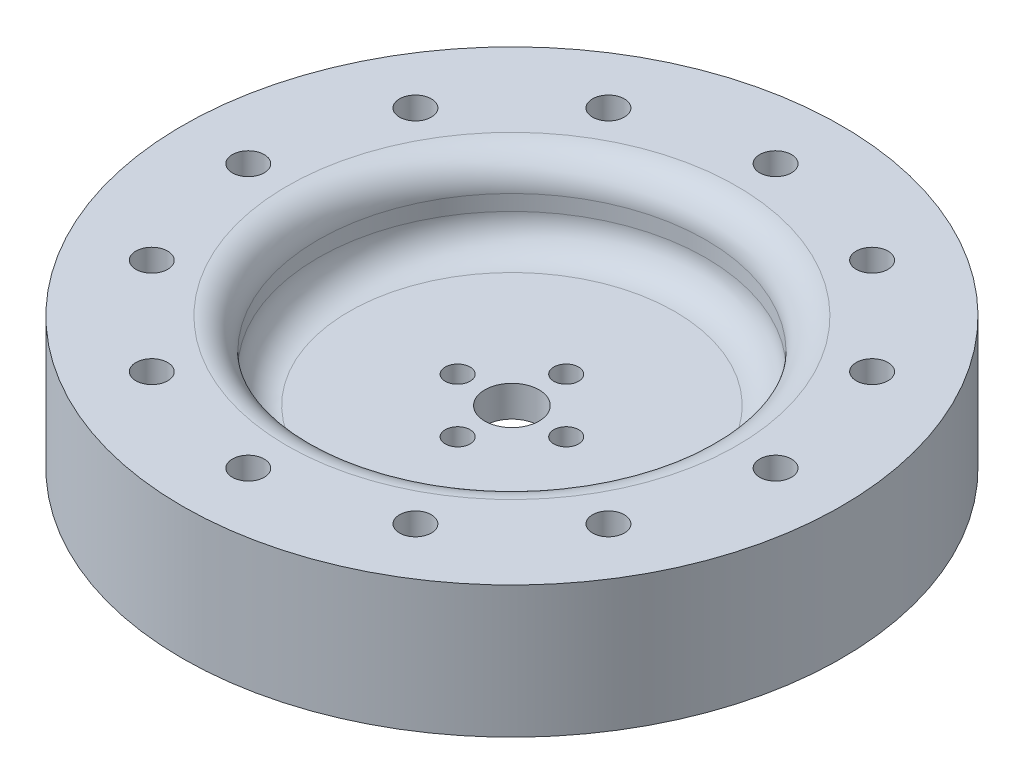
ISO-10303-21;
HEADER;
FILE_DESCRIPTION(('STEP AP214'),'2;1');
FILE_NAME('part.step','',(''),(''),'','','');
FILE_SCHEMA(('AUTOMOTIVE_DESIGN { 1 0 10303 214 1 1 1 1 }'));
ENDSEC;
DATA;
#1=APPLICATION_CONTEXT('core data for automotive mechanical design processes');
#2=APPLICATION_PROTOCOL_DEFINITION('international standard','automotive_design',2000,#1);
#3=PRODUCT_CONTEXT('',#1,'mechanical');
#4=PRODUCT('Part','Part','',(#3));
#5=PRODUCT_RELATED_PRODUCT_CATEGORY('part','',(#4));
#6=PRODUCT_DEFINITION_FORMATION('','',#4);
#7=PRODUCT_DEFINITION_CONTEXT('part definition',#1,'design');
#8=PRODUCT_DEFINITION('design','',#6,#7);
#9=PRODUCT_DEFINITION_SHAPE('','',#8);
#10=(LENGTH_UNIT() NAMED_UNIT(*) SI_UNIT(.MILLI.,.METRE.));
#11=(NAMED_UNIT(*) PLANE_ANGLE_UNIT() SI_UNIT($,.RADIAN.));
#12=(NAMED_UNIT(*) SI_UNIT($,.STERADIAN.) SOLID_ANGLE_UNIT());
#13=UNCERTAINTY_MEASURE_WITH_UNIT(LENGTH_MEASURE(1.E-05),#10,'distance_accuracy_value','');
#14=(GEOMETRIC_REPRESENTATION_CONTEXT(3) GLOBAL_UNCERTAINTY_ASSIGNED_CONTEXT((#13)) GLOBAL_UNIT_ASSIGNED_CONTEXT((#10,
#11,#12)) REPRESENTATION_CONTEXT('',''));
#15=CARTESIAN_POINT('',(0.,0.,0.));
#16=DIRECTION('',(0.,0.,1.));
#17=DIRECTION('',(1.,0.,0.));
#18=AXIS2_PLACEMENT_3D('',#15,#16,#17);
#19=CARTESIAN_POINT('',(7.,17.,0.));
#20=DIRECTION('',(0.,-1.,0.));
#21=DIRECTION('',(0.,0.,-1.));
#22=AXIS2_PLACEMENT_3D('',#19,#20,#21);
#23=CYLINDRICAL_SURFACE('',#22,1.6);
#24=CARTESIAN_POINT('',(7.,7.,0.));
#25=DIRECTION('',(0.,1.,0.));
#26=DIRECTION('',(0.,0.,1.));
#27=AXIS2_PLACEMENT_3D('',#24,#25,#26);
#28=CIRCLE('',#27,1.6);
#29=CARTESIAN_POINT('',(7.,7.,1.6));
#30=VERTEX_POINT('',#29);
#31=EDGE_CURVE('E140',#30,#30,#28,.T.);
#32=ORIENTED_EDGE('',*,*,#31,.T.);
#33=EDGE_LOOP('',(#32));
#34=FACE_BOUND('',#33,.T.);
#35=CARTESIAN_POINT('',(7.,3.,0.));
#36=DIRECTION('',(0.,-1.,0.));
#37=DIRECTION('',(0.,0.,-1.));
#38=AXIS2_PLACEMENT_3D('',#35,#36,#37);
#39=CIRCLE('',#38,1.6);
#40=CARTESIAN_POINT('',(7.,3.,-1.6));
#41=VERTEX_POINT('',#40);
#42=EDGE_CURVE('E64',#41,#41,#39,.T.);
#43=ORIENTED_EDGE('',*,*,#42,.T.);
#44=EDGE_LOOP('',(#43));
#45=FACE_BOUND('',#44,.T.);
#46=ADVANCED_FACE('F39',(#34,#45),#23,.F.);
#47=CARTESIAN_POINT('',(0.,17.,0.));
#48=DIRECTION('',(0.,-1.,0.));
#49=DIRECTION('',(0.,0.,-1.));
#50=AXIS2_PLACEMENT_3D('',#47,#48,#49);
#51=CYLINDRICAL_SURFACE('',#50,3.5);
#52=CARTESIAN_POINT('',(0.,7.,0.));
#53=DIRECTION('',(0.,1.,0.));
#54=DIRECTION('',(0.,0.,1.));
#55=AXIS2_PLACEMENT_3D('',#52,#53,#54);
#56=CIRCLE('',#55,3.5);
#57=CARTESIAN_POINT('',(0.,7.,3.5));
#58=VERTEX_POINT('',#57);
#59=EDGE_CURVE('E145',#58,#58,#56,.T.);
#60=ORIENTED_EDGE('',*,*,#59,.T.);
#61=EDGE_LOOP('',(#60));
#62=FACE_BOUND('',#61,.T.);
#63=CARTESIAN_POINT('',(0.,3.,0.));
#64=DIRECTION('',(0.,-1.,0.));
#65=DIRECTION('',(0.,0.,-1.));
#66=AXIS2_PLACEMENT_3D('',#63,#64,#65);
#67=CIRCLE('',#66,3.5);
#68=CARTESIAN_POINT('',(0.,3.,-3.5));
#69=VERTEX_POINT('',#68);
#70=EDGE_CURVE('E155',#69,#69,#67,.T.);
#71=ORIENTED_EDGE('',*,*,#70,.T.);
#72=EDGE_LOOP('',(#71));
#73=FACE_BOUND('',#72,.T.);
#74=ADVANCED_FACE('F189',(#62,#73),#51,.F.);
#75=CARTESIAN_POINT('',(0.,17.,7.));
#76=DIRECTION('',(0.,-1.,0.));
#77=DIRECTION('',(0.,0.,-1.));
#78=AXIS2_PLACEMENT_3D('',#75,#76,#77);
#79=CYLINDRICAL_SURFACE('',#78,1.6);
#80=CARTESIAN_POINT('',(0.,7.,7.));
#81=DIRECTION('',(0.,1.,0.));
#82=DIRECTION('',(0.,0.,1.));
#83=AXIS2_PLACEMENT_3D('',#80,#81,#82);
#84=CIRCLE('',#83,1.6);
#85=CARTESIAN_POINT('',(0.,7.,8.6));
#86=VERTEX_POINT('',#85);
#87=EDGE_CURVE('E148',#86,#86,#84,.T.);
#88=ORIENTED_EDGE('',*,*,#87,.T.);
#89=EDGE_LOOP('',(#88));
#90=FACE_BOUND('',#89,.T.);
#91=CARTESIAN_POINT('',(0.,3.,7.));
#92=DIRECTION('',(0.,-1.,0.));
#93=DIRECTION('',(0.,0.,-1.));
#94=AXIS2_PLACEMENT_3D('',#91,#92,#93);
#95=CIRCLE('',#94,1.6);
#96=CARTESIAN_POINT('',(0.,3.,5.4));
#97=VERTEX_POINT('',#96);
#98=EDGE_CURVE('E158',#97,#97,#95,.T.);
#99=ORIENTED_EDGE('',*,*,#98,.T.);
#100=EDGE_LOOP('',(#99));
#101=FACE_BOUND('',#100,.T.);
#102=ADVANCED_FACE('F195',(#90,#101),#79,.F.);
#103=CARTESIAN_POINT('',(-7.,17.,0.));
#104=DIRECTION('',(0.,-1.,0.));
#105=DIRECTION('',(0.,0.,-1.));
#106=AXIS2_PLACEMENT_3D('',#103,#104,#105);
#107=CYLINDRICAL_SURFACE('',#106,1.6);
#108=CARTESIAN_POINT('',(-7.,7.,0.));
#109=DIRECTION('',(0.,1.,0.));
#110=DIRECTION('',(0.,0.,1.));
#111=AXIS2_PLACEMENT_3D('',#108,#109,#110);
#112=CIRCLE('',#111,1.6);
#113=CARTESIAN_POINT('',(-7.,7.,1.6));
#114=VERTEX_POINT('',#113);
#115=EDGE_CURVE('E63',#114,#114,#112,.T.);
#116=ORIENTED_EDGE('',*,*,#115,.T.);
#117=EDGE_LOOP('',(#116));
#118=FACE_BOUND('',#117,.T.);
#119=CARTESIAN_POINT('',(-7.,3.,0.));
#120=DIRECTION('',(0.,-1.,0.));
#121=DIRECTION('',(0.,0.,-1.));
#122=AXIS2_PLACEMENT_3D('',#119,#120,#121);
#123=CIRCLE('',#122,1.6);
#124=CARTESIAN_POINT('',(-7.,3.,-1.6));
#125=VERTEX_POINT('',#124);
#126=EDGE_CURVE('E161',#125,#125,#123,.T.);
#127=ORIENTED_EDGE('',*,*,#126,.T.);
#128=EDGE_LOOP('',(#127));
#129=FACE_BOUND('',#128,.T.);
#130=ADVANCED_FACE('F243',(#118,#129),#107,.F.);
#131=CARTESIAN_POINT('',(0.,17.,-7.));
#132=DIRECTION('',(0.,-1.,0.));
#133=DIRECTION('',(0.,0.,-1.));
#134=AXIS2_PLACEMENT_3D('',#131,#132,#133);
#135=CYLINDRICAL_SURFACE('',#134,1.6);
#136=CARTESIAN_POINT('',(0.,7.,-7.));
#137=DIRECTION('',(0.,1.,0.));
#138=DIRECTION('',(0.,0.,1.));
#139=AXIS2_PLACEMENT_3D('',#136,#137,#138);
#140=CIRCLE('',#139,1.6);
#141=CARTESIAN_POINT('',(0.,7.,-5.4));
#142=VERTEX_POINT('',#141);
#143=EDGE_CURVE('E60',#142,#142,#140,.T.);
#144=ORIENTED_EDGE('',*,*,#143,.T.);
#145=EDGE_LOOP('',(#144));
#146=FACE_BOUND('',#145,.T.);
#147=CARTESIAN_POINT('',(0.,3.,-7.));
#148=DIRECTION('',(0.,-1.,0.));
#149=DIRECTION('',(0.,0.,-1.));
#150=AXIS2_PLACEMENT_3D('',#147,#148,#149);
#151=CIRCLE('',#150,1.6);
#152=CARTESIAN_POINT('',(0.,3.,-8.6));
#153=VERTEX_POINT('',#152);
#154=EDGE_CURVE('E43',#153,#153,#151,.T.);
#155=ORIENTED_EDGE('',*,*,#154,.T.);
#156=EDGE_LOOP('',(#155));
#157=FACE_BOUND('',#156,.T.);
#158=ADVANCED_FACE('F174',(#146,#157),#135,.F.);
#159=CARTESIAN_POINT('',(0.,17.,0.));
#160=DIRECTION('',(0.,1.,0.));
#161=DIRECTION('',(0.,0.,1.));
#162=AXIS2_PLACEMENT_3D('',#159,#160,#161);
#163=PLANE('',#162);
#164=CARTESIAN_POINT('',(0.,17.,0.));
#165=DIRECTION('',(0.,1.,0.));
#166=DIRECTION('',(0.,0.,1.));
#167=AXIS2_PLACEMENT_3D('',#164,#165,#166);
#168=CIRCLE('',#167,29.);
#169=CARTESIAN_POINT('',(0.,17.,29.));
#170=VERTEX_POINT('',#169);
#171=EDGE_CURVE('E10',#170,#170,#168,.F.);
#172=ORIENTED_EDGE('',*,*,#171,.T.);
#173=EDGE_LOOP('',(#172));
#174=FACE_BOUND('',#173,.T.);
#175=CARTESIAN_POINT('',(29.4448637286709,17.,-17.));
#176=DIRECTION('',(0.,1.,0.));
#177=DIRECTION('',(0.,0.,1.));
#178=AXIS2_PLACEMENT_3D('',#175,#176,#177);
#179=CIRCLE('',#178,2.05);
#180=CARTESIAN_POINT('',(29.4448637286709,17.,-14.95));
#181=VERTEX_POINT('',#180);
#182=EDGE_CURVE('E134',#181,#181,#179,.T.);
#183=ORIENTED_EDGE('',*,*,#182,.F.);
#184=EDGE_LOOP('',(#183));
#185=FACE_BOUND('',#184,.T.);
#186=CARTESIAN_POINT('',(0.,17.,-34.));
#187=DIRECTION('',(0.,1.,0.));
#188=DIRECTION('',(0.,0.,1.));
#189=AXIS2_PLACEMENT_3D('',#186,#187,#188);
#190=CIRCLE('',#189,2.04999999999999);
#191=CARTESIAN_POINT('',(0.,17.,-31.95));
#192=VERTEX_POINT('',#191);
#193=EDGE_CURVE('E122',#192,#192,#190,.T.);
#194=ORIENTED_EDGE('',*,*,#193,.F.);
#195=EDGE_LOOP('',(#194));
#196=FACE_BOUND('',#195,.T.);
#197=CARTESIAN_POINT('',(-29.4448637286709,17.,-17.));
#198=DIRECTION('',(0.,1.,0.));
#199=DIRECTION('',(0.,0.,1.));
#200=AXIS2_PLACEMENT_3D('',#197,#198,#199);
#201=CIRCLE('',#200,2.04999999999999);
#202=CARTESIAN_POINT('',(-29.4448637286709,17.,-14.95));
#203=VERTEX_POINT('',#202);
#204=EDGE_CURVE('E110',#203,#203,#201,.T.);
#205=ORIENTED_EDGE('',*,*,#204,.F.);
#206=EDGE_LOOP('',(#205));
#207=FACE_BOUND('',#206,.T.);
#208=CARTESIAN_POINT('',(-29.4448637286709,17.,17.));
#209=DIRECTION('',(0.,1.,0.));
#210=DIRECTION('',(0.,0.,1.));
#211=AXIS2_PLACEMENT_3D('',#208,#209,#210);
#212=CIRCLE('',#211,2.04999999999999);
#213=CARTESIAN_POINT('',(-29.4448637286709,17.,19.05));
#214=VERTEX_POINT('',#213);
#215=EDGE_CURVE('E98',#214,#214,#212,.T.);
#216=ORIENTED_EDGE('',*,*,#215,.F.);
#217=EDGE_LOOP('',(#216));
#218=FACE_BOUND('',#217,.T.);
#219=CARTESIAN_POINT('',(0.,17.,34.));
#220=DIRECTION('',(0.,1.,0.));
#221=DIRECTION('',(0.,0.,1.));
#222=AXIS2_PLACEMENT_3D('',#219,#220,#221);
#223=CIRCLE('',#222,2.04999999999999);
#224=CARTESIAN_POINT('',(0.,17.,36.05));
#225=VERTEX_POINT('',#224);
#226=EDGE_CURVE('E86',#225,#225,#223,.T.);
#227=ORIENTED_EDGE('',*,*,#226,.F.);
#228=EDGE_LOOP('',(#227));
#229=FACE_BOUND('',#228,.T.);
#230=CARTESIAN_POINT('',(29.4448637286709,17.,17.));
#231=DIRECTION('',(0.,1.,0.));
#232=DIRECTION('',(0.,0.,1.));
#233=AXIS2_PLACEMENT_3D('',#230,#231,#232);
#234=CIRCLE('',#233,2.04999999999999);
#235=CARTESIAN_POINT('',(29.4448637286709,17.,19.05));
#236=VERTEX_POINT('',#235);
#237=EDGE_CURVE('E74',#236,#236,#234,.T.);
#238=ORIENTED_EDGE('',*,*,#237,.F.);
#239=EDGE_LOOP('',(#238));
#240=FACE_BOUND('',#239,.T.);
#241=CARTESIAN_POINT('',(0.,17.,0.));
#242=DIRECTION('',(0.,1.,0.));
#243=DIRECTION('',(0.,0.,1.));
#244=AXIS2_PLACEMENT_3D('',#241,#242,#243);
#245=CIRCLE('',#244,42.5);
#246=CARTESIAN_POINT('',(0.,17.,42.5));
#247=VERTEX_POINT('',#246);
#248=EDGE_CURVE('E59',#247,#247,#245,.T.);
#249=ORIENTED_EDGE('',*,*,#248,.T.);
#250=EDGE_LOOP('',(#249));
#251=FACE_BOUND('',#250,.T.);
#252=CARTESIAN_POINT('',(34.,17.,0.));
#253=DIRECTION('',(0.,1.,0.));
#254=DIRECTION('',(0.,0.,1.));
#255=AXIS2_PLACEMENT_3D('',#252,#253,#254);
#256=CIRCLE('',#255,2.04999999999999);
#257=CARTESIAN_POINT('',(34.,17.,2.04999999999999));
#258=VERTEX_POINT('',#257);
#259=EDGE_CURVE('E68',#258,#258,#256,.T.);
#260=ORIENTED_EDGE('',*,*,#259,.F.);
#261=EDGE_LOOP('',(#260));
#262=FACE_BOUND('',#261,.T.);
#263=CARTESIAN_POINT('',(17.,17.,29.4448637286709));
#264=DIRECTION('',(0.,1.,0.));
#265=DIRECTION('',(0.,0.,1.));
#266=AXIS2_PLACEMENT_3D('',#263,#264,#265);
#267=CIRCLE('',#266,2.05);
#268=CARTESIAN_POINT('',(17.,17.,31.4948637286709));
#269=VERTEX_POINT('',#268);
#270=EDGE_CURVE('E80',#269,#269,#267,.T.);
#271=ORIENTED_EDGE('',*,*,#270,.F.);
#272=EDGE_LOOP('',(#271));
#273=FACE_BOUND('',#272,.T.);
#274=CARTESIAN_POINT('',(-17.,17.,29.4448637286709));
#275=DIRECTION('',(0.,1.,0.));
#276=DIRECTION('',(0.,0.,1.));
#277=AXIS2_PLACEMENT_3D('',#274,#275,#276);
#278=CIRCLE('',#277,2.05);
#279=CARTESIAN_POINT('',(-17.,17.,31.4948637286709));
#280=VERTEX_POINT('',#279);
#281=EDGE_CURVE('E92',#280,#280,#278,.T.);
#282=ORIENTED_EDGE('',*,*,#281,.F.);
#283=EDGE_LOOP('',(#282));
#284=FACE_BOUND('',#283,.T.);
#285=CARTESIAN_POINT('',(-34.,17.,0.));
#286=DIRECTION('',(0.,1.,0.));
#287=DIRECTION('',(0.,0.,1.));
#288=AXIS2_PLACEMENT_3D('',#285,#286,#287);
#289=CIRCLE('',#288,2.04999999999999);
#290=CARTESIAN_POINT('',(-34.,17.,2.05));
#291=VERTEX_POINT('',#290);
#292=EDGE_CURVE('E104',#291,#291,#289,.T.);
#293=ORIENTED_EDGE('',*,*,#292,.F.);
#294=EDGE_LOOP('',(#293));
#295=FACE_BOUND('',#294,.T.);
#296=CARTESIAN_POINT('',(-17.,17.,-29.4448637286709));
#297=DIRECTION('',(0.,1.,0.));
#298=DIRECTION('',(0.,0.,1.));
#299=AXIS2_PLACEMENT_3D('',#296,#297,#298);
#300=CIRCLE('',#299,2.04999999999999);
#301=CARTESIAN_POINT('',(-17.,17.,-27.3948637286709));
#302=VERTEX_POINT('',#301);
#303=EDGE_CURVE('E116',#302,#302,#300,.T.);
#304=ORIENTED_EDGE('',*,*,#303,.F.);
#305=EDGE_LOOP('',(#304));
#306=FACE_BOUND('',#305,.T.);
#307=CARTESIAN_POINT('',(17.,17.,-29.4448637286709));
#308=DIRECTION('',(0.,1.,0.));
#309=DIRECTION('',(0.,0.,1.));
#310=AXIS2_PLACEMENT_3D('',#307,#308,#309);
#311=CIRCLE('',#310,2.04999999999999);
#312=CARTESIAN_POINT('',(17.,17.,-27.3948637286709));
#313=VERTEX_POINT('',#312);
#314=EDGE_CURVE('E128',#313,#313,#311,.T.);
#315=ORIENTED_EDGE('',*,*,#314,.F.);
#316=EDGE_LOOP('',(#315));
#317=FACE_BOUND('',#316,.T.);
#318=ADVANCED_FACE('F207',(#174,#185,#196,#207,#218,#229,#240,#251,#262,#273,#284,#295,#306,
#317),#163,.T.);
#319=CARTESIAN_POINT('',(0.,0.,0.));
#320=DIRECTION('',(0.,1.,0.));
#321=DIRECTION('',(0.,0.,1.));
#322=AXIS2_PLACEMENT_3D('',#319,#320,#321);
#323=PLANE('',#322);
#324=CARTESIAN_POINT('',(0.,0.,0.));
#325=DIRECTION('',(0.,-1.,0.));
#326=DIRECTION('',(0.,0.,-1.));
#327=AXIS2_PLACEMENT_3D('',#324,#325,#326);
#328=CIRCLE('',#327,12.);
#329=CARTESIAN_POINT('',(0.,0.,-12.));
#330=VERTEX_POINT('',#329);
#331=EDGE_CURVE('E164',#330,#330,#328,.T.);
#332=ORIENTED_EDGE('',*,*,#331,.F.);
#333=EDGE_LOOP('',(#332));
#334=FACE_BOUND('',#333,.T.);
#335=CARTESIAN_POINT('',(0.,0.,0.));
#336=DIRECTION('',(0.,1.,0.));
#337=DIRECTION('',(0.,0.,1.));
#338=AXIS2_PLACEMENT_3D('',#335,#336,#337);
#339=CIRCLE('',#338,42.5);
#340=CARTESIAN_POINT('',(0.,0.,42.5));
#341=VERTEX_POINT('',#340);
#342=EDGE_CURVE('E65',#341,#341,#339,.T.);
#343=ORIENTED_EDGE('',*,*,#342,.F.);
#344=EDGE_LOOP('',(#343));
#345=FACE_BOUND('',#344,.T.);
#346=CARTESIAN_POINT('',(34.,0.,0.));
#347=DIRECTION('',(0.,1.,0.));
#348=DIRECTION('',(0.,0.,1.));
#349=AXIS2_PLACEMENT_3D('',#346,#347,#348);
#350=CIRCLE('',#349,2.04999999999999);
#351=CARTESIAN_POINT('',(34.,0.,2.04999999999999));
#352=VERTEX_POINT('',#351);
#353=EDGE_CURVE('E71',#352,#352,#350,.T.);
#354=ORIENTED_EDGE('',*,*,#353,.T.);
#355=EDGE_LOOP('',(#354));
#356=FACE_BOUND('',#355,.T.);
#357=CARTESIAN_POINT('',(29.4448637286709,0.,17.));
#358=DIRECTION('',(0.,1.,0.));
#359=DIRECTION('',(0.,0.,1.));
#360=AXIS2_PLACEMENT_3D('',#357,#358,#359);
#361=CIRCLE('',#360,2.04999999999999);
#362=CARTESIAN_POINT('',(29.4448637286709,0.,19.05));
#363=VERTEX_POINT('',#362);
#364=EDGE_CURVE('E77',#363,#363,#361,.T.);
#365=ORIENTED_EDGE('',*,*,#364,.T.);
#366=EDGE_LOOP('',(#365));
#367=FACE_BOUND('',#366,.T.);
#368=CARTESIAN_POINT('',(17.,0.,29.4448637286709));
#369=DIRECTION('',(0.,1.,0.));
#370=DIRECTION('',(0.,0.,1.));
#371=AXIS2_PLACEMENT_3D('',#368,#369,#370);
#372=CIRCLE('',#371,2.05);
#373=CARTESIAN_POINT('',(17.,0.,31.4948637286709));
#374=VERTEX_POINT('',#373);
#375=EDGE_CURVE('E83',#374,#374,#372,.T.);
#376=ORIENTED_EDGE('',*,*,#375,.T.);
#377=EDGE_LOOP('',(#376));
#378=FACE_BOUND('',#377,.T.);
#379=CARTESIAN_POINT('',(0.,0.,34.));
#380=DIRECTION('',(0.,1.,0.));
#381=DIRECTION('',(0.,0.,1.));
#382=AXIS2_PLACEMENT_3D('',#379,#380,#381);
#383=CIRCLE('',#382,2.04999999999999);
#384=CARTESIAN_POINT('',(0.,0.,36.05));
#385=VERTEX_POINT('',#384);
#386=EDGE_CURVE('E89',#385,#385,#383,.T.);
#387=ORIENTED_EDGE('',*,*,#386,.T.);
#388=EDGE_LOOP('',(#387));
#389=FACE_BOUND('',#388,.T.);
#390=CARTESIAN_POINT('',(-17.,0.,29.4448637286709));
#391=DIRECTION('',(0.,1.,0.));
#392=DIRECTION('',(0.,0.,1.));
#393=AXIS2_PLACEMENT_3D('',#390,#391,#392);
#394=CIRCLE('',#393,2.05);
#395=CARTESIAN_POINT('',(-17.,0.,31.4948637286709));
#396=VERTEX_POINT('',#395);
#397=EDGE_CURVE('E95',#396,#396,#394,.T.);
#398=ORIENTED_EDGE('',*,*,#397,.T.);
#399=EDGE_LOOP('',(#398));
#400=FACE_BOUND('',#399,.T.);
#401=CARTESIAN_POINT('',(-29.4448637286709,0.,17.));
#402=DIRECTION('',(0.,1.,0.));
#403=DIRECTION('',(0.,0.,1.));
#404=AXIS2_PLACEMENT_3D('',#401,#402,#403);
#405=CIRCLE('',#404,2.04999999999999);
#406=CARTESIAN_POINT('',(-29.4448637286709,0.,19.05));
#407=VERTEX_POINT('',#406);
#408=EDGE_CURVE('E101',#407,#407,#405,.T.);
#409=ORIENTED_EDGE('',*,*,#408,.T.);
#410=EDGE_LOOP('',(#409));
#411=FACE_BOUND('',#410,.T.);
#412=CARTESIAN_POINT('',(-34.,0.,0.));
#413=DIRECTION('',(0.,1.,0.));
#414=DIRECTION('',(0.,0.,1.));
#415=AXIS2_PLACEMENT_3D('',#412,#413,#414);
#416=CIRCLE('',#415,2.04999999999999);
#417=CARTESIAN_POINT('',(-34.,0.,2.05));
#418=VERTEX_POINT('',#417);
#419=EDGE_CURVE('E107',#418,#418,#416,.T.);
#420=ORIENTED_EDGE('',*,*,#419,.T.);
#421=EDGE_LOOP('',(#420));
#422=FACE_BOUND('',#421,.T.);
#423=CARTESIAN_POINT('',(-29.4448637286709,0.,-17.));
#424=DIRECTION('',(0.,1.,0.));
#425=DIRECTION('',(0.,0.,1.));
#426=AXIS2_PLACEMENT_3D('',#423,#424,#425);
#427=CIRCLE('',#426,2.04999999999999);
#428=CARTESIAN_POINT('',(-29.4448637286709,0.,-14.95));
#429=VERTEX_POINT('',#428);
#430=EDGE_CURVE('E113',#429,#429,#427,.T.);
#431=ORIENTED_EDGE('',*,*,#430,.T.);
#432=EDGE_LOOP('',(#431));
#433=FACE_BOUND('',#432,.T.);
#434=CARTESIAN_POINT('',(-17.,0.,-29.4448637286709));
#435=DIRECTION('',(0.,1.,0.));
#436=DIRECTION('',(0.,0.,1.));
#437=AXIS2_PLACEMENT_3D('',#434,#435,#436);
#438=CIRCLE('',#437,2.04999999999999);
#439=CARTESIAN_POINT('',(-17.,0.,-27.3948637286709));
#440=VERTEX_POINT('',#439);
#441=EDGE_CURVE('E119',#440,#440,#438,.T.);
#442=ORIENTED_EDGE('',*,*,#441,.T.);
#443=EDGE_LOOP('',(#442));
#444=FACE_BOUND('',#443,.T.);
#445=CARTESIAN_POINT('',(0.,0.,-34.));
#446=DIRECTION('',(0.,1.,0.));
#447=DIRECTION('',(0.,0.,1.));
#448=AXIS2_PLACEMENT_3D('',#445,#446,#447);
#449=CIRCLE('',#448,2.04999999999999);
#450=CARTESIAN_POINT('',(0.,0.,-31.95));
#451=VERTEX_POINT('',#450);
#452=EDGE_CURVE('E125',#451,#451,#449,.T.);
#453=ORIENTED_EDGE('',*,*,#452,.T.);
#454=EDGE_LOOP('',(#453));
#455=FACE_BOUND('',#454,.T.);
#456=CARTESIAN_POINT('',(17.,0.,-29.4448637286709));
#457=DIRECTION('',(0.,1.,0.));
#458=DIRECTION('',(0.,0.,1.));
#459=AXIS2_PLACEMENT_3D('',#456,#457,#458);
#460=CIRCLE('',#459,2.04999999999999);
#461=CARTESIAN_POINT('',(17.,0.,-27.3948637286709));
#462=VERTEX_POINT('',#461);
#463=EDGE_CURVE('E131',#462,#462,#460,.T.);
#464=ORIENTED_EDGE('',*,*,#463,.T.);
#465=EDGE_LOOP('',(#464));
#466=FACE_BOUND('',#465,.T.);
#467=CARTESIAN_POINT('',(29.4448637286709,0.,-17.));
#468=DIRECTION('',(0.,1.,0.));
#469=DIRECTION('',(0.,0.,1.));
#470=AXIS2_PLACEMENT_3D('',#467,#468,#469);
#471=CIRCLE('',#470,2.05);
#472=CARTESIAN_POINT('',(29.4448637286709,0.,-14.95));
#473=VERTEX_POINT('',#472);
#474=EDGE_CURVE('E137',#473,#473,#471,.T.);
#475=ORIENTED_EDGE('',*,*,#474,.T.);
#476=EDGE_LOOP('',(#475));
#477=FACE_BOUND('',#476,.T.);
#478=ADVANCED_FACE('F210',(#334,#345,#356,#367,#378,#389,#400,#411,#422,#433,#444,#455,#466,
#477),#323,.F.);
#479=CARTESIAN_POINT('',(0.,17.,0.));
#480=DIRECTION('',(0.,-1.,0.));
#481=DIRECTION('',(0.,0.,-1.));
#482=AXIS2_PLACEMENT_3D('',#479,#480,#481);
#483=CYLINDRICAL_SURFACE('',#482,42.5);
#484=ORIENTED_EDGE('',*,*,#248,.F.);
#485=EDGE_LOOP('',(#484));
#486=FACE_BOUND('',#485,.T.);
#487=ORIENTED_EDGE('',*,*,#342,.T.);
#488=EDGE_LOOP('',(#487));
#489=FACE_BOUND('',#488,.T.);
#490=ADVANCED_FACE('F205',(#486,#489),#483,.T.);
#491=CARTESIAN_POINT('',(34.,17.,0.));
#492=DIRECTION('',(0.,-1.,0.));
#493=DIRECTION('',(0.,0.,-1.));
#494=AXIS2_PLACEMENT_3D('',#491,#492,#493);
#495=CYLINDRICAL_SURFACE('',#494,2.04999999999999);
#496=ORIENTED_EDGE('',*,*,#259,.T.);
#497=EDGE_LOOP('',(#496));
#498=FACE_BOUND('',#497,.T.);
#499=ORIENTED_EDGE('',*,*,#353,.F.);
#500=EDGE_LOOP('',(#499));
#501=FACE_BOUND('',#500,.T.);
#502=ADVANCED_FACE('F201',(#498,#501),#495,.F.);
#503=CARTESIAN_POINT('',(29.4448637286709,17.,17.));
#504=DIRECTION('',(0.,-1.,0.));
#505=DIRECTION('',(0.,0.,-1.));
#506=AXIS2_PLACEMENT_3D('',#503,#504,#505);
#507=CYLINDRICAL_SURFACE('',#506,2.04999999999999);
#508=ORIENTED_EDGE('',*,*,#237,.T.);
#509=EDGE_LOOP('',(#508));
#510=FACE_BOUND('',#509,.T.);
#511=ORIENTED_EDGE('',*,*,#364,.F.);
#512=EDGE_LOOP('',(#511));
#513=FACE_BOUND('',#512,.T.);
#514=ADVANCED_FACE('F204',(#510,#513),#507,.F.);
#515=CARTESIAN_POINT('',(17.,17.,29.4448637286709));
#516=DIRECTION('',(0.,-1.,0.));
#517=DIRECTION('',(0.,0.,-1.));
#518=AXIS2_PLACEMENT_3D('',#515,#516,#517);
#519=CYLINDRICAL_SURFACE('',#518,2.05);
#520=ORIENTED_EDGE('',*,*,#270,.T.);
#521=EDGE_LOOP('',(#520));
#522=FACE_BOUND('',#521,.T.);
#523=ORIENTED_EDGE('',*,*,#375,.F.);
#524=EDGE_LOOP('',(#523));
#525=FACE_BOUND('',#524,.T.);
#526=ADVANCED_FACE('F290',(#522,#525),#519,.F.);
#527=CARTESIAN_POINT('',(0.,17.,34.));
#528=DIRECTION('',(0.,-1.,0.));
#529=DIRECTION('',(0.,0.,-1.));
#530=AXIS2_PLACEMENT_3D('',#527,#528,#529);
#531=CYLINDRICAL_SURFACE('',#530,2.04999999999999);
#532=ORIENTED_EDGE('',*,*,#226,.T.);
#533=EDGE_LOOP('',(#532));
#534=FACE_BOUND('',#533,.T.);
#535=ORIENTED_EDGE('',*,*,#386,.F.);
#536=EDGE_LOOP('',(#535));
#537=FACE_BOUND('',#536,.T.);
#538=ADVANCED_FACE('F286',(#534,#537),#531,.F.);
#539=CARTESIAN_POINT('',(-17.,17.,29.4448637286709));
#540=DIRECTION('',(0.,-1.,0.));
#541=DIRECTION('',(0.,0.,-1.));
#542=AXIS2_PLACEMENT_3D('',#539,#540,#541);
#543=CYLINDRICAL_SURFACE('',#542,2.05);
#544=ORIENTED_EDGE('',*,*,#281,.T.);
#545=EDGE_LOOP('',(#544));
#546=FACE_BOUND('',#545,.T.);
#547=ORIENTED_EDGE('',*,*,#397,.F.);
#548=EDGE_LOOP('',(#547));
#549=FACE_BOUND('',#548,.T.);
#550=ADVANCED_FACE('F282',(#546,#549),#543,.F.);
#551=CARTESIAN_POINT('',(-29.4448637286709,17.,17.));
#552=DIRECTION('',(0.,-1.,0.));
#553=DIRECTION('',(0.,0.,-1.));
#554=AXIS2_PLACEMENT_3D('',#551,#552,#553);
#555=CYLINDRICAL_SURFACE('',#554,2.04999999999999);
#556=ORIENTED_EDGE('',*,*,#215,.T.);
#557=EDGE_LOOP('',(#556));
#558=FACE_BOUND('',#557,.T.);
#559=ORIENTED_EDGE('',*,*,#408,.F.);
#560=EDGE_LOOP('',(#559));
#561=FACE_BOUND('',#560,.T.);
#562=ADVANCED_FACE('F278',(#558,#561),#555,.F.);
#563=CARTESIAN_POINT('',(-34.,17.,0.));
#564=DIRECTION('',(0.,-1.,0.));
#565=DIRECTION('',(0.,0.,-1.));
#566=AXIS2_PLACEMENT_3D('',#563,#564,#565);
#567=CYLINDRICAL_SURFACE('',#566,2.04999999999999);
#568=ORIENTED_EDGE('',*,*,#292,.T.);
#569=EDGE_LOOP('',(#568));
#570=FACE_BOUND('',#569,.T.);
#571=ORIENTED_EDGE('',*,*,#419,.F.);
#572=EDGE_LOOP('',(#571));
#573=FACE_BOUND('',#572,.T.);
#574=ADVANCED_FACE('F274',(#570,#573),#567,.F.);
#575=CARTESIAN_POINT('',(-29.4448637286709,17.,-17.));
#576=DIRECTION('',(0.,-1.,0.));
#577=DIRECTION('',(0.,0.,-1.));
#578=AXIS2_PLACEMENT_3D('',#575,#576,#577);
#579=CYLINDRICAL_SURFACE('',#578,2.04999999999999);
#580=ORIENTED_EDGE('',*,*,#204,.T.);
#581=EDGE_LOOP('',(#580));
#582=FACE_BOUND('',#581,.T.);
#583=ORIENTED_EDGE('',*,*,#430,.F.);
#584=EDGE_LOOP('',(#583));
#585=FACE_BOUND('',#584,.T.);
#586=ADVANCED_FACE('F270',(#582,#585),#579,.F.);
#587=CARTESIAN_POINT('',(-17.,17.,-29.4448637286709));
#588=DIRECTION('',(0.,-1.,0.));
#589=DIRECTION('',(0.,0.,-1.));
#590=AXIS2_PLACEMENT_3D('',#587,#588,#589);
#591=CYLINDRICAL_SURFACE('',#590,2.04999999999999);
#592=ORIENTED_EDGE('',*,*,#303,.T.);
#593=EDGE_LOOP('',(#592));
#594=FACE_BOUND('',#593,.T.);
#595=ORIENTED_EDGE('',*,*,#441,.F.);
#596=EDGE_LOOP('',(#595));
#597=FACE_BOUND('',#596,.T.);
#598=ADVANCED_FACE('F266',(#594,#597),#591,.F.);
#599=CARTESIAN_POINT('',(0.,17.,-34.));
#600=DIRECTION('',(0.,-1.,0.));
#601=DIRECTION('',(0.,0.,-1.));
#602=AXIS2_PLACEMENT_3D('',#599,#600,#601);
#603=CYLINDRICAL_SURFACE('',#602,2.04999999999999);
#604=ORIENTED_EDGE('',*,*,#193,.T.);
#605=EDGE_LOOP('',(#604));
#606=FACE_BOUND('',#605,.T.);
#607=ORIENTED_EDGE('',*,*,#452,.F.);
#608=EDGE_LOOP('',(#607));
#609=FACE_BOUND('',#608,.T.);
#610=ADVANCED_FACE('F262',(#606,#609),#603,.F.);
#611=CARTESIAN_POINT('',(17.,17.,-29.4448637286709));
#612=DIRECTION('',(0.,-1.,0.));
#613=DIRECTION('',(0.,0.,-1.));
#614=AXIS2_PLACEMENT_3D('',#611,#612,#613);
#615=CYLINDRICAL_SURFACE('',#614,2.04999999999999);
#616=ORIENTED_EDGE('',*,*,#314,.T.);
#617=EDGE_LOOP('',(#616));
#618=FACE_BOUND('',#617,.T.);
#619=ORIENTED_EDGE('',*,*,#463,.F.);
#620=EDGE_LOOP('',(#619));
#621=FACE_BOUND('',#620,.T.);
#622=ADVANCED_FACE('F258',(#618,#621),#615,.F.);
#623=CARTESIAN_POINT('',(29.4448637286709,17.,-17.));
#624=DIRECTION('',(0.,-1.,0.));
#625=DIRECTION('',(0.,0.,-1.));
#626=AXIS2_PLACEMENT_3D('',#623,#624,#625);
#627=CYLINDRICAL_SURFACE('',#626,2.05);
#628=ORIENTED_EDGE('',*,*,#182,.T.);
#629=EDGE_LOOP('',(#628));
#630=FACE_BOUND('',#629,.T.);
#631=ORIENTED_EDGE('',*,*,#474,.F.);
#632=EDGE_LOOP('',(#631));
#633=FACE_BOUND('',#632,.T.);
#634=ADVANCED_FACE('F255',(#630,#633),#627,.F.);
#635=CARTESIAN_POINT('',(0.,7.,0.));
#636=DIRECTION('',(0.,1.,0.));
#637=DIRECTION('',(0.,0.,1.));
#638=AXIS2_PLACEMENT_3D('',#635,#636,#637);
#639=CYLINDRICAL_SURFACE('',#638,25.);
#640=CARTESIAN_POINT('',(0.,11.,0.));
#641=DIRECTION('',(0.,1.,0.));
#642=DIRECTION('',(0.,0.,1.));
#643=AXIS2_PLACEMENT_3D('',#640,#641,#642);
#644=CIRCLE('',#643,25.);
#645=CARTESIAN_POINT('',(0.,11.,25.));
#646=VERTEX_POINT('',#645);
#647=EDGE_CURVE('E47',#646,#646,#644,.F.);
#648=ORIENTED_EDGE('',*,*,#647,.T.);
#649=EDGE_LOOP('',(#648));
#650=FACE_BOUND('',#649,.T.);
#651=CARTESIAN_POINT('',(0.,13.,0.));
#652=DIRECTION('',(0.,1.,0.));
#653=DIRECTION('',(0.,0.,1.));
#654=AXIS2_PLACEMENT_3D('',#651,#652,#653);
#655=CIRCLE('',#654,25.);
#656=CARTESIAN_POINT('',(0.,13.,25.));
#657=VERTEX_POINT('',#656);
#658=EDGE_CURVE('E51',#657,#657,#655,.T.);
#659=ORIENTED_EDGE('',*,*,#658,.T.);
#660=EDGE_LOOP('',(#659));
#661=FACE_BOUND('',#660,.T.);
#662=ADVANCED_FACE('F225',(#650,#661),#639,.F.);
#663=CARTESIAN_POINT('',(0.,7.,0.));
#664=DIRECTION('',(0.,1.,0.));
#665=DIRECTION('',(0.,0.,1.));
#666=AXIS2_PLACEMENT_3D('',#663,#664,#665);
#667=PLANE('',#666);
#668=CARTESIAN_POINT('',(0.,7.,0.));
#669=DIRECTION('',(0.,1.,0.));
#670=DIRECTION('',(0.,0.,1.));
#671=AXIS2_PLACEMENT_3D('',#668,#669,#670);
#672=CIRCLE('',#671,21.);
#673=CARTESIAN_POINT('',(0.,7.,21.));
#674=VERTEX_POINT('',#673);
#675=EDGE_CURVE('E56',#674,#674,#672,.T.);
#676=ORIENTED_EDGE('',*,*,#675,.T.);
#677=EDGE_LOOP('',(#676));
#678=FACE_BOUND('',#677,.T.);
#679=ORIENTED_EDGE('',*,*,#31,.F.);
#680=EDGE_LOOP('',(#679));
#681=FACE_BOUND('',#680,.T.);
#682=ORIENTED_EDGE('',*,*,#59,.F.);
#683=EDGE_LOOP('',(#682));
#684=FACE_BOUND('',#683,.T.);
#685=ORIENTED_EDGE('',*,*,#87,.F.);
#686=EDGE_LOOP('',(#685));
#687=FACE_BOUND('',#686,.T.);
#688=ORIENTED_EDGE('',*,*,#115,.F.);
#689=EDGE_LOOP('',(#688));
#690=FACE_BOUND('',#689,.T.);
#691=ORIENTED_EDGE('',*,*,#143,.F.);
#692=EDGE_LOOP('',(#691));
#693=FACE_BOUND('',#692,.T.);
#694=ADVANCED_FACE('F218',(#678,#681,#684,#687,#690,#693),#667,.T.);
#695=CARTESIAN_POINT('',(0.,11.,0.));
#696=DIRECTION('',(0.,1.,0.));
#697=DIRECTION('',(0.,0.,1.));
#698=AXIS2_PLACEMENT_3D('',#695,#696,#697);
#699=TOROIDAL_SURFACE('',#698,21.,4.);
#700=ORIENTED_EDGE('',*,*,#647,.F.);
#701=EDGE_LOOP('',(#700));
#702=FACE_BOUND('',#701,.T.);
#703=ORIENTED_EDGE('',*,*,#675,.F.);
#704=EDGE_LOOP('',(#703));
#705=FACE_BOUND('',#704,.T.);
#706=ADVANCED_FACE('F216',(#702,#705),#699,.F.);
#707=CARTESIAN_POINT('',(0.,13.,0.));
#708=DIRECTION('',(0.,1.,0.));
#709=DIRECTION('',(0.,0.,1.));
#710=AXIS2_PLACEMENT_3D('',#707,#708,#709);
#711=TOROIDAL_SURFACE('',#710,29.,4.);
#712=ORIENTED_EDGE('',*,*,#171,.F.);
#713=EDGE_LOOP('',(#712));
#714=FACE_BOUND('',#713,.T.);
#715=ORIENTED_EDGE('',*,*,#658,.F.);
#716=EDGE_LOOP('',(#715));
#717=FACE_BOUND('',#716,.T.);
#718=ADVANCED_FACE('F41',(#714,#717),#711,.T.);
#719=CARTESIAN_POINT('',(0.,3.,0.));
#720=DIRECTION('',(0.,-1.,0.));
#721=DIRECTION('',(0.,0.,-1.));
#722=AXIS2_PLACEMENT_3D('',#719,#720,#721);
#723=CYLINDRICAL_SURFACE('',#722,12.);
#724=CARTESIAN_POINT('',(0.,3.,0.));
#725=DIRECTION('',(0.,-1.,0.));
#726=DIRECTION('',(0.,0.,-1.));
#727=AXIS2_PLACEMENT_3D('',#724,#725,#726);
#728=CIRCLE('',#727,12.);
#729=CARTESIAN_POINT('',(0.,3.,-12.));
#730=VERTEX_POINT('',#729);
#731=EDGE_CURVE('E167',#730,#730,#728,.T.);
#732=ORIENTED_EDGE('',*,*,#731,.F.);
#733=EDGE_LOOP('',(#732));
#734=FACE_BOUND('',#733,.T.);
#735=ORIENTED_EDGE('',*,*,#331,.T.);
#736=EDGE_LOOP('',(#735));
#737=FACE_BOUND('',#736,.T.);
#738=ADVANCED_FACE('F178',(#734,#737),#723,.F.);
#739=CARTESIAN_POINT('',(0.,3.,0.));
#740=DIRECTION('',(0.,-1.,0.));
#741=DIRECTION('',(0.,0.,-1.));
#742=AXIS2_PLACEMENT_3D('',#739,#740,#741);
#743=PLANE('',#742);
#744=ORIENTED_EDGE('',*,*,#42,.F.);
#745=EDGE_LOOP('',(#744));
#746=FACE_BOUND('',#745,.T.);
#747=ORIENTED_EDGE('',*,*,#70,.F.);
#748=EDGE_LOOP('',(#747));
#749=FACE_BOUND('',#748,.T.);
#750=ORIENTED_EDGE('',*,*,#98,.F.);
#751=EDGE_LOOP('',(#750));
#752=FACE_BOUND('',#751,.T.);
#753=ORIENTED_EDGE('',*,*,#126,.F.);
#754=EDGE_LOOP('',(#753));
#755=FACE_BOUND('',#754,.T.);
#756=ORIENTED_EDGE('',*,*,#154,.F.);
#757=EDGE_LOOP('',(#756));
#758=FACE_BOUND('',#757,.T.);
#759=ORIENTED_EDGE('',*,*,#731,.T.);
#760=EDGE_LOOP('',(#759));
#761=FACE_BOUND('',#760,.T.);
#762=ADVANCED_FACE('F176',(#746,#749,#752,#755,#758,#761),#743,.T.);
#763=CLOSED_SHELL('',(#46,#74,#102,#130,#158,#318,#478,#490,#502,#514,#526,#538,#550,#562,#574,
#586,#598,#610,#622,#634,#662,#694,#706,#718,#738,#762));
#764=MANIFOLD_SOLID_BREP('B2',#763);
#765=ADVANCED_BREP_SHAPE_REPRESENTATION('',(#18,#764),#14);
#766=SHAPE_DEFINITION_REPRESENTATION(#9,#765);
ENDSEC;
END-ISO-10303-21;
